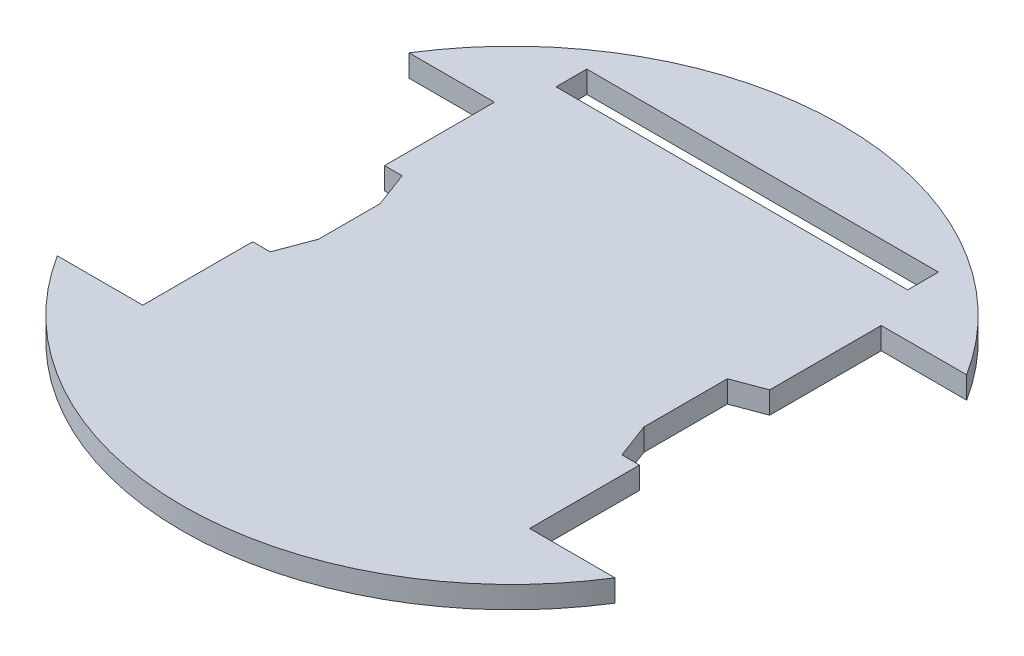
ISO-10303-21;
HEADER;
FILE_DESCRIPTION(('STEP AP214'),'2;1');
FILE_NAME('part.step','',(''),(''),'','','');
FILE_SCHEMA(('AUTOMOTIVE_DESIGN { 1 0 10303 214 1 1 1 1 }'));
ENDSEC;
DATA;
#1=APPLICATION_CONTEXT('core data for automotive mechanical design processes');
#2=APPLICATION_PROTOCOL_DEFINITION('international standard','automotive_design',2000,#1);
#3=PRODUCT_CONTEXT('',#1,'mechanical');
#4=PRODUCT('Part','Part','',(#3));
#5=PRODUCT_RELATED_PRODUCT_CATEGORY('part','',(#4));
#6=PRODUCT_DEFINITION_FORMATION('','',#4);
#7=PRODUCT_DEFINITION_CONTEXT('part definition',#1,'design');
#8=PRODUCT_DEFINITION('design','',#6,#7);
#9=PRODUCT_DEFINITION_SHAPE('','',#8);
#10=(LENGTH_UNIT() NAMED_UNIT(*) SI_UNIT(.MILLI.,.METRE.));
#11=(NAMED_UNIT(*) PLANE_ANGLE_UNIT() SI_UNIT($,.RADIAN.));
#12=(NAMED_UNIT(*) SI_UNIT($,.STERADIAN.) SOLID_ANGLE_UNIT());
#13=UNCERTAINTY_MEASURE_WITH_UNIT(LENGTH_MEASURE(1.E-05),#10,'distance_accuracy_value','');
#14=(GEOMETRIC_REPRESENTATION_CONTEXT(3) GLOBAL_UNCERTAINTY_ASSIGNED_CONTEXT((#13)) GLOBAL_UNIT_ASSIGNED_CONTEXT((#10,
#11,#12)) REPRESENTATION_CONTEXT('',''));
#15=CARTESIAN_POINT('',(0.,0.,0.));
#16=DIRECTION('',(0.,0.,1.));
#17=DIRECTION('',(1.,0.,0.));
#18=AXIS2_PLACEMENT_3D('',#15,#16,#17);
#19=CARTESIAN_POINT('',(0.,5.,0.));
#20=DIRECTION('',(0.,1.,0.));
#21=DIRECTION('',(0.,0.,1.));
#22=AXIS2_PLACEMENT_3D('',#19,#20,#21);
#23=PLANE('',#22);
#24=DIRECTION('',(1.,0.,0.));
#25=VECTOR('',#24,1.);
#26=CARTESIAN_POINT('',(-44.,5.,-15.));
#27=LINE('',#26,#25);
#28=CARTESIAN_POINT('',(-44.,5.,-15.));
#29=VERTEX_POINT('',#28);
#30=CARTESIAN_POINT('',(-40.,5.,-15.));
#31=VERTEX_POINT('',#30);
#32=EDGE_CURVE('E232',#29,#31,#27,.T.);
#33=ORIENTED_EDGE('',*,*,#32,.T.);
#34=DIRECTION('',(-0.351123441588396,0.,-0.936329177569043));
#35=VECTOR('',#34,1.);
#36=CARTESIAN_POINT('',(-37.,5.,-7.00000000000015));
#37=LINE('',#36,#35);
#38=CARTESIAN_POINT('',(-37.,5.,-7.00000000000015));
#39=VERTEX_POINT('',#38);
#40=EDGE_CURVE('E11',#31,#39,#37,.F.);
#41=ORIENTED_EDGE('',*,*,#40,.T.);
#42=DIRECTION('',(0.,0.,1.));
#43=VECTOR('',#42,1.);
#44=CARTESIAN_POINT('',(-37.,5.,15.));
#45=LINE('',#44,#43);
#46=CARTESIAN_POINT('',(-37.,5.,7.));
#47=VERTEX_POINT('',#46);
#48=EDGE_CURVE('E235',#39,#47,#45,.T.);
#49=ORIENTED_EDGE('',*,*,#48,.T.);
#50=DIRECTION('',(0.351123441588397,0.,-0.936329177569043));
#51=VECTOR('',#50,1.);
#52=CARTESIAN_POINT('',(-40.0000000000001,5.,15.));
#53=LINE('',#52,#51);
#54=CARTESIAN_POINT('',(-40.0000000000001,5.,15.));
#55=VERTEX_POINT('',#54);
#56=EDGE_CURVE('E360',#47,#55,#53,.F.);
#57=ORIENTED_EDGE('',*,*,#56,.T.);
#58=DIRECTION('',(-1.,0.,0.));
#59=VECTOR('',#58,1.);
#60=CARTESIAN_POINT('',(-44.,5.,15.));
#61=LINE('',#60,#59);
#62=CARTESIAN_POINT('',(-44.,5.,15.));
#63=VERTEX_POINT('',#62);
#64=EDGE_CURVE('E239',#55,#63,#61,.T.);
#65=ORIENTED_EDGE('',*,*,#64,.T.);
#66=DIRECTION('',(0.,0.,1.));
#67=VECTOR('',#66,1.);
#68=CARTESIAN_POINT('',(-44.,5.,40.));
#69=LINE('',#68,#67);
#70=CARTESIAN_POINT('',(-44.,5.,40.));
#71=VERTEX_POINT('',#70);
#72=EDGE_CURVE('E241',#63,#71,#69,.T.);
#73=ORIENTED_EDGE('',*,*,#72,.T.);
#74=DIRECTION('',(-1.,0.,0.));
#75=VECTOR('',#74,1.);
#76=CARTESIAN_POINT('',(-44.,5.,40.));
#77=LINE('',#76,#75);
#78=CARTESIAN_POINT('',(-63.4428877022476,5.,40.));
#79=VERTEX_POINT('',#78);
#80=EDGE_CURVE('E243',#71,#79,#77,.T.);
#81=ORIENTED_EDGE('',*,*,#80,.T.);
#82=CARTESIAN_POINT('',(0.,5.,0.));
#83=DIRECTION('',(0.,1.,0.));
#84=DIRECTION('',(0.,0.,1.));
#85=AXIS2_PLACEMENT_3D('',#82,#83,#84);
#86=CIRCLE('',#85,75.);
#87=CARTESIAN_POINT('',(63.4428877022476,5.,40.));
#88=VERTEX_POINT('',#87);
#89=EDGE_CURVE('E245',#79,#88,#86,.T.);
#90=ORIENTED_EDGE('',*,*,#89,.T.);
#91=DIRECTION('',(-1.,0.,0.));
#92=VECTOR('',#91,1.);
#93=CARTESIAN_POINT('',(44.,5.,40.));
#94=LINE('',#93,#92);
#95=CARTESIAN_POINT('',(44.,5.,40.));
#96=VERTEX_POINT('',#95);
#97=EDGE_CURVE('E247',#88,#96,#94,.T.);
#98=ORIENTED_EDGE('',*,*,#97,.T.);
#99=DIRECTION('',(0.,0.,-1.));
#100=VECTOR('',#99,1.);
#101=CARTESIAN_POINT('',(44.,5.,40.));
#102=LINE('',#101,#100);
#103=CARTESIAN_POINT('',(44.,5.,15.));
#104=VERTEX_POINT('',#103);
#105=EDGE_CURVE('E249',#96,#104,#102,.T.);
#106=ORIENTED_EDGE('',*,*,#105,.T.);
#107=DIRECTION('',(-1.,0.,0.));
#108=VECTOR('',#107,1.);
#109=CARTESIAN_POINT('',(44.,5.,15.));
#110=LINE('',#109,#108);
#111=CARTESIAN_POINT('',(40.,5.,15.));
#112=VERTEX_POINT('',#111);
#113=EDGE_CURVE('E251',#104,#112,#110,.T.);
#114=ORIENTED_EDGE('',*,*,#113,.T.);
#115=DIRECTION('',(0.351123441588396,0.,0.936329177569043));
#116=VECTOR('',#115,1.);
#117=CARTESIAN_POINT('',(37.,5.,7.00000000000015));
#118=LINE('',#117,#116);
#119=CARTESIAN_POINT('',(37.,5.,7.00000000000015));
#120=VERTEX_POINT('',#119);
#121=EDGE_CURVE('E350',#112,#120,#118,.F.);
#122=ORIENTED_EDGE('',*,*,#121,.T.);
#123=DIRECTION('',(0.,0.,-1.));
#124=VECTOR('',#123,1.);
#125=CARTESIAN_POINT('',(37.,5.,15.));
#126=LINE('',#125,#124);
#127=CARTESIAN_POINT('',(37.,5.,-12.));
#128=VERTEX_POINT('',#127);
#129=EDGE_CURVE('E254',#120,#128,#126,.T.);
#130=ORIENTED_EDGE('',*,*,#129,.T.);
#131=DIRECTION('',(-0.936329177569043,0.,0.351123441588397));
#132=VECTOR('',#131,1.);
#133=CARTESIAN_POINT('',(45.,5.,-15.));
#134=LINE('',#133,#132);
#135=CARTESIAN_POINT('',(44.,5.,-14.625));
#136=VERTEX_POINT('',#135);
#137=EDGE_CURVE('E356',#128,#136,#134,.F.);
#138=ORIENTED_EDGE('',*,*,#137,.T.);
#139=DIRECTION('',(0.,0.,-1.));
#140=VECTOR('',#139,1.);
#141=CARTESIAN_POINT('',(44.,5.,-40.));
#142=LINE('',#141,#140);
#143=CARTESIAN_POINT('',(44.,5.,-40.));
#144=VERTEX_POINT('',#143);
#145=EDGE_CURVE('E51',#136,#144,#142,.T.);
#146=ORIENTED_EDGE('',*,*,#145,.T.);
#147=DIRECTION('',(1.,0.,0.));
#148=VECTOR('',#147,1.);
#149=CARTESIAN_POINT('',(44.,5.,-40.));
#150=LINE('',#149,#148);
#151=CARTESIAN_POINT('',(63.4428877022476,5.,-40.));
#152=VERTEX_POINT('',#151);
#153=EDGE_CURVE('E258',#144,#152,#150,.T.);
#154=ORIENTED_EDGE('',*,*,#153,.T.);
#155=CARTESIAN_POINT('',(0.,5.,0.));
#156=DIRECTION('',(0.,1.,0.));
#157=DIRECTION('',(0.,0.,1.));
#158=AXIS2_PLACEMENT_3D('',#155,#156,#157);
#159=CIRCLE('',#158,75.);
#160=CARTESIAN_POINT('',(-63.4428877022476,5.,-40.));
#161=VERTEX_POINT('',#160);
#162=EDGE_CURVE('E260',#152,#161,#159,.T.);
#163=ORIENTED_EDGE('',*,*,#162,.T.);
#164=DIRECTION('',(1.,0.,0.));
#165=VECTOR('',#164,1.);
#166=CARTESIAN_POINT('',(-44.,5.,-40.));
#167=LINE('',#166,#165);
#168=CARTESIAN_POINT('',(-44.,5.,-40.));
#169=VERTEX_POINT('',#168);
#170=EDGE_CURVE('E262',#161,#169,#167,.T.);
#171=ORIENTED_EDGE('',*,*,#170,.T.);
#172=DIRECTION('',(0.,0.,1.));
#173=VECTOR('',#172,1.);
#174=CARTESIAN_POINT('',(-44.,5.,-40.));
#175=LINE('',#174,#173);
#176=EDGE_CURVE('E264',#169,#29,#175,.T.);
#177=ORIENTED_EDGE('',*,*,#176,.T.);
#178=EDGE_LOOP('',(#33,#41,#49,#57,#65,#73,#81,#90,#98,#106,#114,#122,#130,#138,#146,#154,#163,
#171,#177));
#179=FACE_BOUND('',#178,.T.);
#180=DIRECTION('',(1.,0.,0.));
#181=VECTOR('',#180,1.);
#182=CARTESIAN_POINT('',(40.,5.,-50.0244449579621));
#183=LINE('',#182,#181);
#184=CARTESIAN_POINT('',(-40.,5.,-50.0244449579621));
#185=VERTEX_POINT('',#184);
#186=CARTESIAN_POINT('',(40.,5.,-50.0244449579621));
#187=VERTEX_POINT('',#186);
#188=EDGE_CURVE('E201',#185,#187,#183,.T.);
#189=ORIENTED_EDGE('',*,*,#188,.F.);
#190=DIRECTION('',(0.,0.,1.));
#191=VECTOR('',#190,1.);
#192=CARTESIAN_POINT('',(-40.,5.,-50.0244449579621));
#193=LINE('',#192,#191);
#194=CARTESIAN_POINT('',(-40.,5.,-57.0244449579621));
#195=VERTEX_POINT('',#194);
#196=EDGE_CURVE('E191',#195,#185,#193,.T.);
#197=ORIENTED_EDGE('',*,*,#196,.F.);
#198=DIRECTION('',(-1.,0.,0.));
#199=VECTOR('',#198,1.);
#200=CARTESIAN_POINT('',(40.,5.,-57.0244449579621));
#201=LINE('',#200,#199);
#202=CARTESIAN_POINT('',(40.,5.,-57.0244449579621));
#203=VERTEX_POINT('',#202);
#204=EDGE_CURVE('E216',#203,#195,#201,.T.);
#205=ORIENTED_EDGE('',*,*,#204,.F.);
#206=DIRECTION('',(0.,0.,-1.));
#207=VECTOR('',#206,1.);
#208=CARTESIAN_POINT('',(40.,5.,-50.0244449579621));
#209=LINE('',#208,#207);
#210=EDGE_CURVE('E214',#187,#203,#209,.T.);
#211=ORIENTED_EDGE('',*,*,#210,.F.);
#212=EDGE_LOOP('',(#189,#197,#205,#211));
#213=FACE_BOUND('',#212,.T.);
#214=ADVANCED_FACE('F35',(#179,#213),#23,.T.);
#215=CARTESIAN_POINT('',(0.,0.,0.));
#216=DIRECTION('',(0.,1.,0.));
#217=DIRECTION('',(0.,0.,1.));
#218=AXIS2_PLACEMENT_3D('',#215,#216,#217);
#219=PLANE('',#218);
#220=DIRECTION('',(1.,0.,0.));
#221=VECTOR('',#220,1.);
#222=CARTESIAN_POINT('',(-44.,0.,-15.));
#223=LINE('',#222,#221);
#224=CARTESIAN_POINT('',(-44.,0.,-15.));
#225=VERTEX_POINT('',#224);
#226=CARTESIAN_POINT('',(-40.,0.,-15.));
#227=VERTEX_POINT('',#226);
#228=EDGE_CURVE('E209',#225,#227,#223,.T.);
#229=ORIENTED_EDGE('',*,*,#228,.F.);
#230=DIRECTION('',(0.,0.,1.));
#231=VECTOR('',#230,1.);
#232=CARTESIAN_POINT('',(-44.,0.,-40.));
#233=LINE('',#232,#231);
#234=CARTESIAN_POINT('',(-44.,0.,-40.));
#235=VERTEX_POINT('',#234);
#236=EDGE_CURVE('E236',#235,#225,#233,.T.);
#237=ORIENTED_EDGE('',*,*,#236,.F.);
#238=DIRECTION('',(1.,0.,0.));
#239=VECTOR('',#238,1.);
#240=CARTESIAN_POINT('',(-44.,0.,-40.));
#241=LINE('',#240,#239);
#242=CARTESIAN_POINT('',(-63.4428877022476,0.,-40.));
#243=VERTEX_POINT('',#242);
#244=EDGE_CURVE('E295',#243,#235,#241,.T.);
#245=ORIENTED_EDGE('',*,*,#244,.F.);
#246=CARTESIAN_POINT('',(0.,0.,0.));
#247=DIRECTION('',(0.,1.,0.));
#248=DIRECTION('',(0.,0.,1.));
#249=AXIS2_PLACEMENT_3D('',#246,#247,#248);
#250=CIRCLE('',#249,75.);
#251=CARTESIAN_POINT('',(63.4428877022476,0.,-40.));
#252=VERTEX_POINT('',#251);
#253=EDGE_CURVE('E293',#252,#243,#250,.T.);
#254=ORIENTED_EDGE('',*,*,#253,.F.);
#255=DIRECTION('',(1.,0.,0.));
#256=VECTOR('',#255,1.);
#257=CARTESIAN_POINT('',(44.,0.,-40.));
#258=LINE('',#257,#256);
#259=CARTESIAN_POINT('',(44.,0.,-40.));
#260=VERTEX_POINT('',#259);
#261=EDGE_CURVE('E291',#260,#252,#258,.T.);
#262=ORIENTED_EDGE('',*,*,#261,.F.);
#263=DIRECTION('',(0.,0.,-1.));
#264=VECTOR('',#263,1.);
#265=CARTESIAN_POINT('',(44.,0.,-40.));
#266=LINE('',#265,#264);
#267=CARTESIAN_POINT('',(44.,0.,-14.625));
#268=VERTEX_POINT('',#267);
#269=EDGE_CURVE('E59',#268,#260,#266,.T.);
#270=ORIENTED_EDGE('',*,*,#269,.F.);
#271=DIRECTION('',(0.936329177569043,0.,-0.351123441588397));
#272=VECTOR('',#271,1.);
#273=CARTESIAN_POINT('',(0.616438356164473,0.,1.64383561643857));
#274=LINE('',#273,#272);
#275=CARTESIAN_POINT('',(37.,0.,-12.));
#276=VERTEX_POINT('',#275);
#277=EDGE_CURVE('E354',#268,#276,#274,.F.);
#278=ORIENTED_EDGE('',*,*,#277,.T.);
#279=DIRECTION('',(0.,0.,-1.));
#280=VECTOR('',#279,1.);
#281=CARTESIAN_POINT('',(37.,0.,15.));
#282=LINE('',#281,#280);
#283=CARTESIAN_POINT('',(37.,0.,7.00000000000015));
#284=VERTEX_POINT('',#283);
#285=EDGE_CURVE('E287',#284,#276,#282,.T.);
#286=ORIENTED_EDGE('',*,*,#285,.F.);
#287=DIRECTION('',(-0.351123441588396,0.,-0.936329177569043));
#288=VECTOR('',#287,1.);
#289=CARTESIAN_POINT('',(30.1369863013697,0.,-11.3013698630138));
#290=LINE('',#289,#288);
#291=CARTESIAN_POINT('',(40.,0.,15.));
#292=VERTEX_POINT('',#291);
#293=EDGE_CURVE('E348',#284,#292,#290,.F.);
#294=ORIENTED_EDGE('',*,*,#293,.T.);
#295=DIRECTION('',(-1.,0.,0.));
#296=VECTOR('',#295,1.);
#297=CARTESIAN_POINT('',(44.,0.,15.));
#298=LINE('',#297,#296);
#299=CARTESIAN_POINT('',(44.,0.,15.));
#300=VERTEX_POINT('',#299);
#301=EDGE_CURVE('E284',#300,#292,#298,.T.);
#302=ORIENTED_EDGE('',*,*,#301,.F.);
#303=DIRECTION('',(0.,0.,-1.));
#304=VECTOR('',#303,1.);
#305=CARTESIAN_POINT('',(44.,0.,40.));
#306=LINE('',#305,#304);
#307=CARTESIAN_POINT('',(44.,0.,40.));
#308=VERTEX_POINT('',#307);
#309=EDGE_CURVE('E282',#308,#300,#306,.T.);
#310=ORIENTED_EDGE('',*,*,#309,.F.);
#311=DIRECTION('',(-1.,0.,0.));
#312=VECTOR('',#311,1.);
#313=CARTESIAN_POINT('',(44.,0.,40.));
#314=LINE('',#313,#312);
#315=CARTESIAN_POINT('',(63.4428877022476,0.,40.));
#316=VERTEX_POINT('',#315);
#317=EDGE_CURVE('E280',#316,#308,#314,.T.);
#318=ORIENTED_EDGE('',*,*,#317,.F.);
#319=CARTESIAN_POINT('',(0.,0.,0.));
#320=DIRECTION('',(0.,1.,0.));
#321=DIRECTION('',(0.,0.,1.));
#322=AXIS2_PLACEMENT_3D('',#319,#320,#321);
#323=CIRCLE('',#322,75.);
#324=CARTESIAN_POINT('',(-63.4428877022476,0.,40.));
#325=VERTEX_POINT('',#324);
#326=EDGE_CURVE('E278',#325,#316,#323,.T.);
#327=ORIENTED_EDGE('',*,*,#326,.F.);
#328=DIRECTION('',(-1.,0.,0.));
#329=VECTOR('',#328,1.);
#330=CARTESIAN_POINT('',(-44.,0.,40.));
#331=LINE('',#330,#329);
#332=CARTESIAN_POINT('',(-44.,0.,40.));
#333=VERTEX_POINT('',#332);
#334=EDGE_CURVE('E276',#333,#325,#331,.T.);
#335=ORIENTED_EDGE('',*,*,#334,.F.);
#336=DIRECTION('',(0.,0.,1.));
#337=VECTOR('',#336,1.);
#338=CARTESIAN_POINT('',(-44.,0.,40.));
#339=LINE('',#338,#337);
#340=CARTESIAN_POINT('',(-44.,0.,15.));
#341=VERTEX_POINT('',#340);
#342=EDGE_CURVE('E274',#341,#333,#339,.T.);
#343=ORIENTED_EDGE('',*,*,#342,.F.);
#344=DIRECTION('',(-1.,0.,0.));
#345=VECTOR('',#344,1.);
#346=CARTESIAN_POINT('',(-44.,0.,15.));
#347=LINE('',#346,#345);
#348=CARTESIAN_POINT('',(-40.0000000000001,0.,15.));
#349=VERTEX_POINT('',#348);
#350=EDGE_CURVE('E272',#349,#341,#347,.T.);
#351=ORIENTED_EDGE('',*,*,#350,.F.);
#352=DIRECTION('',(-0.351123441588397,0.,0.936329177569043));
#353=VECTOR('',#352,1.);
#354=CARTESIAN_POINT('',(-30.1369863013697,0.,-11.3013698630138));
#355=LINE('',#354,#353);
#356=CARTESIAN_POINT('',(-37.,0.,7.));
#357=VERTEX_POINT('',#356);
#358=EDGE_CURVE('E358',#349,#357,#355,.F.);
#359=ORIENTED_EDGE('',*,*,#358,.T.);
#360=DIRECTION('',(0.,0.,1.));
#361=VECTOR('',#360,1.);
#362=CARTESIAN_POINT('',(-37.,0.,15.));
#363=LINE('',#362,#361);
#364=CARTESIAN_POINT('',(-37.,0.,-7.00000000000015));
#365=VERTEX_POINT('',#364);
#366=EDGE_CURVE('E269',#365,#357,#363,.T.);
#367=ORIENTED_EDGE('',*,*,#366,.F.);
#368=DIRECTION('',(0.351123441588396,0.,0.936329177569043));
#369=VECTOR('',#368,1.);
#370=CARTESIAN_POINT('',(-30.1369863013697,0.,11.3013698630138));
#371=LINE('',#370,#369);
#372=EDGE_CURVE('E44',#365,#227,#371,.F.);
#373=ORIENTED_EDGE('',*,*,#372,.T.);
#374=EDGE_LOOP('',(#229,#237,#245,#254,#262,#270,#278,#286,#294,#302,#310,#318,#327,#335,#343,
#351,#359,#367,#373));
#375=FACE_BOUND('',#374,.T.);
#376=DIRECTION('',(0.,0.,1.));
#377=VECTOR('',#376,1.);
#378=CARTESIAN_POINT('',(-40.,0.,-50.0244449579621));
#379=LINE('',#378,#377);
#380=CARTESIAN_POINT('',(-40.,0.,-57.0244449579621));
#381=VERTEX_POINT('',#380);
#382=CARTESIAN_POINT('',(-40.,0.,-50.0244449579621));
#383=VERTEX_POINT('',#382);
#384=EDGE_CURVE('E220',#381,#383,#379,.T.);
#385=ORIENTED_EDGE('',*,*,#384,.T.);
#386=DIRECTION('',(1.,0.,0.));
#387=VECTOR('',#386,1.);
#388=CARTESIAN_POINT('',(40.,0.,-50.0244449579621));
#389=LINE('',#388,#387);
#390=CARTESIAN_POINT('',(40.,0.,-50.0244449579621));
#391=VERTEX_POINT('',#390);
#392=EDGE_CURVE('E208',#383,#391,#389,.T.);
#393=ORIENTED_EDGE('',*,*,#392,.T.);
#394=DIRECTION('',(0.,0.,-1.));
#395=VECTOR('',#394,1.);
#396=CARTESIAN_POINT('',(40.,0.,-50.0244449579621));
#397=LINE('',#396,#395);
#398=CARTESIAN_POINT('',(40.,0.,-57.0244449579621));
#399=VERTEX_POINT('',#398);
#400=EDGE_CURVE('E223',#391,#399,#397,.T.);
#401=ORIENTED_EDGE('',*,*,#400,.T.);
#402=DIRECTION('',(-1.,0.,0.));
#403=VECTOR('',#402,1.);
#404=CARTESIAN_POINT('',(40.,0.,-57.0244449579621));
#405=LINE('',#404,#403);
#406=EDGE_CURVE('E202',#399,#381,#405,.T.);
#407=ORIENTED_EDGE('',*,*,#406,.T.);
#408=EDGE_LOOP('',(#385,#393,#401,#407));
#409=FACE_BOUND('',#408,.T.);
#410=ADVANCED_FACE('F363',(#375,#409),#219,.F.);
#411=CARTESIAN_POINT('',(-44.,5.,-15.));
#412=DIRECTION('',(0.,0.,-1.));
#413=DIRECTION('',(-1.,0.,0.));
#414=AXIS2_PLACEMENT_3D('',#411,#412,#413);
#415=PLANE('',#414);
#416=ORIENTED_EDGE('',*,*,#228,.T.);
#417=DIRECTION('',(0.,1.,0.));
#418=VECTOR('',#417,1.);
#419=CARTESIAN_POINT('',(-40.,5.,-15.));
#420=LINE('',#419,#418);
#421=EDGE_CURVE('E346',#227,#31,#420,.T.);
#422=ORIENTED_EDGE('',*,*,#421,.T.);
#423=ORIENTED_EDGE('',*,*,#32,.F.);
#424=DIRECTION('',(0.,-1.,0.));
#425=VECTOR('',#424,1.);
#426=CARTESIAN_POINT('',(-44.,5.,-15.));
#427=LINE('',#426,#425);
#428=EDGE_CURVE('E266',#29,#225,#427,.T.);
#429=ORIENTED_EDGE('',*,*,#428,.T.);
#430=EDGE_LOOP('',(#416,#422,#423,#429));
#431=FACE_BOUND('',#430,.T.);
#432=ADVANCED_FACE('F370',(#431),#415,.F.);
#433=CARTESIAN_POINT('',(-37.,5.,15.));
#434=DIRECTION('',(1.,0.,0.));
#435=DIRECTION('',(0.,0.,-1.));
#436=AXIS2_PLACEMENT_3D('',#433,#434,#435);
#437=PLANE('',#436);
#438=ORIENTED_EDGE('',*,*,#366,.T.);
#439=DIRECTION('',(0.,1.,0.));
#440=VECTOR('',#439,1.);
#441=CARTESIAN_POINT('',(-37.,5.,7.));
#442=LINE('',#441,#440);
#443=EDGE_CURVE('E344',#357,#47,#442,.T.);
#444=ORIENTED_EDGE('',*,*,#443,.T.);
#445=ORIENTED_EDGE('',*,*,#48,.F.);
#446=DIRECTION('',(0.,-1.,0.));
#447=VECTOR('',#446,1.);
#448=CARTESIAN_POINT('',(-37.,0.,-7.00000000000015));
#449=LINE('',#448,#447);
#450=EDGE_CURVE('E341',#39,#365,#449,.T.);
#451=ORIENTED_EDGE('',*,*,#450,.T.);
#452=EDGE_LOOP('',(#438,#444,#445,#451));
#453=FACE_BOUND('',#452,.T.);
#454=ADVANCED_FACE('F378',(#453),#437,.F.);
#455=CARTESIAN_POINT('',(-44.,5.,15.));
#456=DIRECTION('',(0.,0.,1.));
#457=DIRECTION('',(1.,0.,0.));
#458=AXIS2_PLACEMENT_3D('',#455,#456,#457);
#459=PLANE('',#458);
#460=ORIENTED_EDGE('',*,*,#64,.F.);
#461=DIRECTION('',(0.,-1.,0.));
#462=VECTOR('',#461,1.);
#463=CARTESIAN_POINT('',(-40.0000000000001,0.,15.));
#464=LINE('',#463,#462);
#465=EDGE_CURVE('E338',#55,#349,#464,.T.);
#466=ORIENTED_EDGE('',*,*,#465,.T.);
#467=ORIENTED_EDGE('',*,*,#350,.T.);
#468=DIRECTION('',(0.,-1.,0.));
#469=VECTOR('',#468,1.);
#470=CARTESIAN_POINT('',(-44.,5.,15.));
#471=LINE('',#470,#469);
#472=EDGE_CURVE('E327',#63,#341,#471,.T.);
#473=ORIENTED_EDGE('',*,*,#472,.F.);
#474=EDGE_LOOP('',(#460,#466,#467,#473));
#475=FACE_BOUND('',#474,.T.);
#476=ADVANCED_FACE('F386',(#475),#459,.F.);
#477=CARTESIAN_POINT('',(-44.,5.,40.));
#478=DIRECTION('',(1.,0.,0.));
#479=DIRECTION('',(0.,0.,-1.));
#480=AXIS2_PLACEMENT_3D('',#477,#478,#479);
#481=PLANE('',#480);
#482=ORIENTED_EDGE('',*,*,#342,.T.);
#483=DIRECTION('',(0.,-1.,0.));
#484=VECTOR('',#483,1.);
#485=CARTESIAN_POINT('',(-44.,5.,40.));
#486=LINE('',#485,#484);
#487=EDGE_CURVE('E324',#71,#333,#486,.T.);
#488=ORIENTED_EDGE('',*,*,#487,.F.);
#489=ORIENTED_EDGE('',*,*,#72,.F.);
#490=ORIENTED_EDGE('',*,*,#472,.T.);
#491=EDGE_LOOP('',(#482,#488,#489,#490));
#492=FACE_BOUND('',#491,.T.);
#493=ADVANCED_FACE('F392',(#492),#481,.F.);
#494=CARTESIAN_POINT('',(-44.,5.,40.));
#495=DIRECTION('',(0.,0.,1.));
#496=DIRECTION('',(1.,0.,0.));
#497=AXIS2_PLACEMENT_3D('',#494,#495,#496);
#498=PLANE('',#497);
#499=ORIENTED_EDGE('',*,*,#334,.T.);
#500=DIRECTION('',(0.,-1.,0.));
#501=VECTOR('',#500,1.);
#502=CARTESIAN_POINT('',(-63.4428877022476,5.,40.));
#503=LINE('',#502,#501);
#504=EDGE_CURVE('E321',#79,#325,#503,.T.);
#505=ORIENTED_EDGE('',*,*,#504,.F.);
#506=ORIENTED_EDGE('',*,*,#80,.F.);
#507=ORIENTED_EDGE('',*,*,#487,.T.);
#508=EDGE_LOOP('',(#499,#505,#506,#507));
#509=FACE_BOUND('',#508,.T.);
#510=ADVANCED_FACE('F398',(#509),#498,.F.);
#511=CARTESIAN_POINT('',(0.,5.,0.));
#512=DIRECTION('',(0.,-1.,0.));
#513=DIRECTION('',(0.,0.,-1.));
#514=AXIS2_PLACEMENT_3D('',#511,#512,#513);
#515=CYLINDRICAL_SURFACE('',#514,75.);
#516=ORIENTED_EDGE('',*,*,#326,.T.);
#517=DIRECTION('',(0.,-1.,0.));
#518=VECTOR('',#517,1.);
#519=CARTESIAN_POINT('',(63.4428877022476,5.,40.));
#520=LINE('',#519,#518);
#521=EDGE_CURVE('E318',#88,#316,#520,.T.);
#522=ORIENTED_EDGE('',*,*,#521,.F.);
#523=ORIENTED_EDGE('',*,*,#89,.F.);
#524=ORIENTED_EDGE('',*,*,#504,.T.);
#525=EDGE_LOOP('',(#516,#522,#523,#524));
#526=FACE_BOUND('',#525,.T.);
#527=ADVANCED_FACE('F402',(#526),#515,.T.);
#528=CARTESIAN_POINT('',(44.,5.,40.));
#529=DIRECTION('',(0.,0.,1.));
#530=DIRECTION('',(1.,0.,0.));
#531=AXIS2_PLACEMENT_3D('',#528,#529,#530);
#532=PLANE('',#531);
#533=ORIENTED_EDGE('',*,*,#317,.T.);
#534=DIRECTION('',(0.,-1.,0.));
#535=VECTOR('',#534,1.);
#536=CARTESIAN_POINT('',(44.,5.,40.));
#537=LINE('',#536,#535);
#538=EDGE_CURVE('E315',#96,#308,#537,.T.);
#539=ORIENTED_EDGE('',*,*,#538,.F.);
#540=ORIENTED_EDGE('',*,*,#97,.F.);
#541=ORIENTED_EDGE('',*,*,#521,.T.);
#542=EDGE_LOOP('',(#533,#539,#540,#541));
#543=FACE_BOUND('',#542,.T.);
#544=ADVANCED_FACE('F407',(#543),#532,.F.);
#545=CARTESIAN_POINT('',(44.,5.,40.));
#546=DIRECTION('',(-1.,0.,0.));
#547=DIRECTION('',(0.,0.,1.));
#548=AXIS2_PLACEMENT_3D('',#545,#546,#547);
#549=PLANE('',#548);
#550=ORIENTED_EDGE('',*,*,#309,.T.);
#551=DIRECTION('',(0.,-1.,0.));
#552=VECTOR('',#551,1.);
#553=CARTESIAN_POINT('',(44.,5.,15.));
#554=LINE('',#553,#552);
#555=EDGE_CURVE('E312',#104,#300,#554,.T.);
#556=ORIENTED_EDGE('',*,*,#555,.F.);
#557=ORIENTED_EDGE('',*,*,#105,.F.);
#558=ORIENTED_EDGE('',*,*,#538,.T.);
#559=EDGE_LOOP('',(#550,#556,#557,#558));
#560=FACE_BOUND('',#559,.T.);
#561=ADVANCED_FACE('F413',(#560),#549,.F.);
#562=CARTESIAN_POINT('',(44.,5.,15.));
#563=DIRECTION('',(0.,0.,1.));
#564=DIRECTION('',(1.,0.,0.));
#565=AXIS2_PLACEMENT_3D('',#562,#563,#564);
#566=PLANE('',#565);
#567=ORIENTED_EDGE('',*,*,#301,.T.);
#568=DIRECTION('',(0.,1.,0.));
#569=VECTOR('',#568,1.);
#570=CARTESIAN_POINT('',(40.,5.,15.));
#571=LINE('',#570,#569);
#572=EDGE_CURVE('E336',#292,#112,#571,.T.);
#573=ORIENTED_EDGE('',*,*,#572,.T.);
#574=ORIENTED_EDGE('',*,*,#113,.F.);
#575=ORIENTED_EDGE('',*,*,#555,.T.);
#576=EDGE_LOOP('',(#567,#573,#574,#575));
#577=FACE_BOUND('',#576,.T.);
#578=ADVANCED_FACE('F417',(#577),#566,.F.);
#579=CARTESIAN_POINT('',(37.,5.,15.));
#580=DIRECTION('',(-1.,0.,0.));
#581=DIRECTION('',(0.,0.,1.));
#582=AXIS2_PLACEMENT_3D('',#579,#580,#581);
#583=PLANE('',#582);
#584=ORIENTED_EDGE('',*,*,#129,.F.);
#585=DIRECTION('',(0.,-1.,0.));
#586=VECTOR('',#585,1.);
#587=CARTESIAN_POINT('',(37.,0.,7.00000000000015));
#588=LINE('',#587,#586);
#589=EDGE_CURVE('E333',#120,#284,#588,.T.);
#590=ORIENTED_EDGE('',*,*,#589,.T.);
#591=ORIENTED_EDGE('',*,*,#285,.T.);
#592=DIRECTION('',(0.,1.,0.));
#593=VECTOR('',#592,1.);
#594=CARTESIAN_POINT('',(37.,5.,-12.));
#595=LINE('',#594,#593);
#596=EDGE_CURVE('E330',#276,#128,#595,.T.);
#597=ORIENTED_EDGE('',*,*,#596,.T.);
#598=EDGE_LOOP('',(#584,#590,#591,#597));
#599=FACE_BOUND('',#598,.T.);
#600=ADVANCED_FACE('F424',(#599),#583,.F.);
#601=CARTESIAN_POINT('',(44.,5.,-40.));
#602=DIRECTION('',(-1.,0.,0.));
#603=DIRECTION('',(0.,0.,1.));
#604=AXIS2_PLACEMENT_3D('',#601,#602,#603);
#605=PLANE('',#604);
#606=ORIENTED_EDGE('',*,*,#269,.T.);
#607=DIRECTION('',(0.,-1.,0.));
#608=VECTOR('',#607,1.);
#609=CARTESIAN_POINT('',(44.,5.,-40.));
#610=LINE('',#609,#608);
#611=EDGE_CURVE('E309',#144,#260,#610,.T.);
#612=ORIENTED_EDGE('',*,*,#611,.F.);
#613=ORIENTED_EDGE('',*,*,#145,.F.);
#614=DIRECTION('',(0.,1.,0.));
#615=VECTOR('',#614,1.);
#616=CARTESIAN_POINT('',(44.,5.,-14.625));
#617=LINE('',#616,#615);
#618=EDGE_CURVE('E352',#136,#268,#617,.F.);
#619=ORIENTED_EDGE('',*,*,#618,.T.);
#620=EDGE_LOOP('',(#606,#612,#613,#619));
#621=FACE_BOUND('',#620,.T.);
#622=ADVANCED_FACE('F433',(#621),#605,.F.);
#623=CARTESIAN_POINT('',(44.,5.,-40.));
#624=DIRECTION('',(0.,0.,-1.));
#625=DIRECTION('',(-1.,0.,0.));
#626=AXIS2_PLACEMENT_3D('',#623,#624,#625);
#627=PLANE('',#626);
#628=ORIENTED_EDGE('',*,*,#261,.T.);
#629=DIRECTION('',(0.,-1.,0.));
#630=VECTOR('',#629,1.);
#631=CARTESIAN_POINT('',(63.4428877022476,5.,-40.));
#632=LINE('',#631,#630);
#633=EDGE_CURVE('E306',#152,#252,#632,.T.);
#634=ORIENTED_EDGE('',*,*,#633,.F.);
#635=ORIENTED_EDGE('',*,*,#153,.F.);
#636=ORIENTED_EDGE('',*,*,#611,.T.);
#637=EDGE_LOOP('',(#628,#634,#635,#636));
#638=FACE_BOUND('',#637,.T.);
#639=ADVANCED_FACE('F435',(#638),#627,.F.);
#640=CARTESIAN_POINT('',(0.,5.,0.));
#641=DIRECTION('',(0.,-1.,0.));
#642=DIRECTION('',(0.,0.,-1.));
#643=AXIS2_PLACEMENT_3D('',#640,#641,#642);
#644=CYLINDRICAL_SURFACE('',#643,75.);
#645=ORIENTED_EDGE('',*,*,#253,.T.);
#646=DIRECTION('',(0.,-1.,0.));
#647=VECTOR('',#646,1.);
#648=CARTESIAN_POINT('',(-63.4428877022476,5.,-40.));
#649=LINE('',#648,#647);
#650=EDGE_CURVE('E303',#161,#243,#649,.T.);
#651=ORIENTED_EDGE('',*,*,#650,.F.);
#652=ORIENTED_EDGE('',*,*,#162,.F.);
#653=ORIENTED_EDGE('',*,*,#633,.T.);
#654=EDGE_LOOP('',(#645,#651,#652,#653));
#655=FACE_BOUND('',#654,.T.);
#656=ADVANCED_FACE('F440',(#655),#644,.T.);
#657=CARTESIAN_POINT('',(-44.,5.,-40.));
#658=DIRECTION('',(0.,0.,-1.));
#659=DIRECTION('',(-1.,0.,0.));
#660=AXIS2_PLACEMENT_3D('',#657,#658,#659);
#661=PLANE('',#660);
#662=ORIENTED_EDGE('',*,*,#244,.T.);
#663=DIRECTION('',(0.,-1.,0.));
#664=VECTOR('',#663,1.);
#665=CARTESIAN_POINT('',(-44.,5.,-40.));
#666=LINE('',#665,#664);
#667=EDGE_CURVE('E300',#169,#235,#666,.T.);
#668=ORIENTED_EDGE('',*,*,#667,.F.);
#669=ORIENTED_EDGE('',*,*,#170,.F.);
#670=ORIENTED_EDGE('',*,*,#650,.T.);
#671=EDGE_LOOP('',(#662,#668,#669,#670));
#672=FACE_BOUND('',#671,.T.);
#673=ADVANCED_FACE('F445',(#672),#661,.F.);
#674=CARTESIAN_POINT('',(-44.,5.,-40.));
#675=DIRECTION('',(1.,0.,0.));
#676=DIRECTION('',(0.,0.,-1.));
#677=AXIS2_PLACEMENT_3D('',#674,#675,#676);
#678=PLANE('',#677);
#679=ORIENTED_EDGE('',*,*,#236,.T.);
#680=ORIENTED_EDGE('',*,*,#428,.F.);
#681=ORIENTED_EDGE('',*,*,#176,.F.);
#682=ORIENTED_EDGE('',*,*,#667,.T.);
#683=EDGE_LOOP('',(#679,#680,#681,#682));
#684=FACE_BOUND('',#683,.T.);
#685=ADVANCED_FACE('F448',(#684),#678,.F.);
#686=CARTESIAN_POINT('',(-40.,5.,-50.0244449579621));
#687=DIRECTION('',(1.,0.,0.));
#688=DIRECTION('',(0.,0.,-1.));
#689=AXIS2_PLACEMENT_3D('',#686,#687,#688);
#690=PLANE('',#689);
#691=ORIENTED_EDGE('',*,*,#384,.F.);
#692=DIRECTION('',(0.,-1.,0.));
#693=VECTOR('',#692,1.);
#694=CARTESIAN_POINT('',(-40.,5.,-57.0244449579621));
#695=LINE('',#694,#693);
#696=EDGE_CURVE('E197',#195,#381,#695,.T.);
#697=ORIENTED_EDGE('',*,*,#696,.F.);
#698=ORIENTED_EDGE('',*,*,#196,.T.);
#699=DIRECTION('',(0.,-1.,0.));
#700=VECTOR('',#699,1.);
#701=CARTESIAN_POINT('',(-40.,5.,-50.0244449579621));
#702=LINE('',#701,#700);
#703=EDGE_CURVE('E194',#185,#383,#702,.T.);
#704=ORIENTED_EDGE('',*,*,#703,.T.);
#705=EDGE_LOOP('',(#691,#697,#698,#704));
#706=FACE_BOUND('',#705,.T.);
#707=ADVANCED_FACE('F193',(#706),#690,.T.);
#708=CARTESIAN_POINT('',(40.,5.,-50.0244449579621));
#709=DIRECTION('',(0.,0.,-1.));
#710=DIRECTION('',(-1.,0.,0.));
#711=AXIS2_PLACEMENT_3D('',#708,#709,#710);
#712=PLANE('',#711);
#713=ORIENTED_EDGE('',*,*,#392,.F.);
#714=ORIENTED_EDGE('',*,*,#703,.F.);
#715=ORIENTED_EDGE('',*,*,#188,.T.);
#716=DIRECTION('',(0.,-1.,0.));
#717=VECTOR('',#716,1.);
#718=CARTESIAN_POINT('',(40.,5.,-50.0244449579621));
#719=LINE('',#718,#717);
#720=EDGE_CURVE('E210',#187,#391,#719,.T.);
#721=ORIENTED_EDGE('',*,*,#720,.T.);
#722=EDGE_LOOP('',(#713,#714,#715,#721));
#723=FACE_BOUND('',#722,.T.);
#724=ADVANCED_FACE('F205',(#723),#712,.T.);
#725=CARTESIAN_POINT('',(40.,5.,-50.0244449579621));
#726=DIRECTION('',(-1.,0.,0.));
#727=DIRECTION('',(0.,0.,1.));
#728=AXIS2_PLACEMENT_3D('',#725,#726,#727);
#729=PLANE('',#728);
#730=ORIENTED_EDGE('',*,*,#400,.F.);
#731=ORIENTED_EDGE('',*,*,#720,.F.);
#732=ORIENTED_EDGE('',*,*,#210,.T.);
#733=DIRECTION('',(0.,-1.,0.));
#734=VECTOR('',#733,1.);
#735=CARTESIAN_POINT('',(40.,5.,-57.0244449579621));
#736=LINE('',#735,#734);
#737=EDGE_CURVE('E229',#203,#399,#736,.T.);
#738=ORIENTED_EDGE('',*,*,#737,.T.);
#739=EDGE_LOOP('',(#730,#731,#732,#738));
#740=FACE_BOUND('',#739,.T.);
#741=ADVANCED_FACE('F466',(#740),#729,.T.);
#742=CARTESIAN_POINT('',(40.,5.,-57.0244449579621));
#743=DIRECTION('',(0.,0.,1.));
#744=DIRECTION('',(1.,0.,0.));
#745=AXIS2_PLACEMENT_3D('',#742,#743,#744);
#746=PLANE('',#745);
#747=ORIENTED_EDGE('',*,*,#406,.F.);
#748=ORIENTED_EDGE('',*,*,#737,.F.);
#749=ORIENTED_EDGE('',*,*,#204,.T.);
#750=ORIENTED_EDGE('',*,*,#696,.T.);
#751=EDGE_LOOP('',(#747,#748,#749,#750));
#752=FACE_BOUND('',#751,.T.);
#753=ADVANCED_FACE('F469',(#752),#746,.T.);
#754=CARTESIAN_POINT('',(37.,5.,7.00000000000015));
#755=DIRECTION('',(0.936329177569043,0.,-0.351123441588396));
#756=DIRECTION('',(0.,1.,0.));
#757=AXIS2_PLACEMENT_3D('',#754,#755,#756);
#758=PLANE('',#757);
#759=ORIENTED_EDGE('',*,*,#121,.F.);
#760=ORIENTED_EDGE('',*,*,#572,.F.);
#761=ORIENTED_EDGE('',*,*,#293,.F.);
#762=ORIENTED_EDGE('',*,*,#589,.F.);
#763=EDGE_LOOP('',(#759,#760,#761,#762));
#764=FACE_BOUND('',#763,.T.);
#765=ADVANCED_FACE('F420',(#764),#758,.T.);
#766=CARTESIAN_POINT('',(45.,5.,-15.));
#767=DIRECTION('',(0.351123441588397,0.,0.936329177569043));
#768=DIRECTION('',(0.,1.,0.));
#769=AXIS2_PLACEMENT_3D('',#766,#767,#768);
#770=PLANE('',#769);
#771=ORIENTED_EDGE('',*,*,#137,.F.);
#772=ORIENTED_EDGE('',*,*,#596,.F.);
#773=ORIENTED_EDGE('',*,*,#277,.F.);
#774=ORIENTED_EDGE('',*,*,#618,.F.);
#775=EDGE_LOOP('',(#771,#772,#773,#774));
#776=FACE_BOUND('',#775,.T.);
#777=ADVANCED_FACE('F429',(#776),#770,.T.);
#778=CARTESIAN_POINT('',(-40.0000000000001,5.,15.));
#779=DIRECTION('',(-0.936329177569043,0.,-0.351123441588397));
#780=DIRECTION('',(0.,1.,0.));
#781=AXIS2_PLACEMENT_3D('',#778,#779,#780);
#782=PLANE('',#781);
#783=ORIENTED_EDGE('',*,*,#56,.F.);
#784=ORIENTED_EDGE('',*,*,#443,.F.);
#785=ORIENTED_EDGE('',*,*,#358,.F.);
#786=ORIENTED_EDGE('',*,*,#465,.F.);
#787=EDGE_LOOP('',(#783,#784,#785,#786));
#788=FACE_BOUND('',#787,.T.);
#789=ADVANCED_FACE('F381',(#788),#782,.T.);
#790=CARTESIAN_POINT('',(-37.,5.,-7.00000000000015));
#791=DIRECTION('',(-0.936329177569043,0.,0.351123441588396));
#792=DIRECTION('',(0.,1.,0.));
#793=AXIS2_PLACEMENT_3D('',#790,#791,#792);
#794=PLANE('',#793);
#795=ORIENTED_EDGE('',*,*,#40,.F.);
#796=ORIENTED_EDGE('',*,*,#421,.F.);
#797=ORIENTED_EDGE('',*,*,#372,.F.);
#798=ORIENTED_EDGE('',*,*,#450,.F.);
#799=EDGE_LOOP('',(#795,#796,#797,#798));
#800=FACE_BOUND('',#799,.T.);
#801=ADVANCED_FACE('F38',(#800),#794,.T.);
#802=CLOSED_SHELL('',(#214,#410,#432,#454,#476,#493,#510,#527,#544,#561,#578,#600,#622,#639,
#656,#673,#685,#707,#724,#741,#753,#765,#777,#789,#801));
#803=MANIFOLD_SOLID_BREP('B2',#802);
#804=ADVANCED_BREP_SHAPE_REPRESENTATION('',(#18,#803),#14);
#805=SHAPE_DEFINITION_REPRESENTATION(#9,#804);
ENDSEC;
END-ISO-10303-21;
